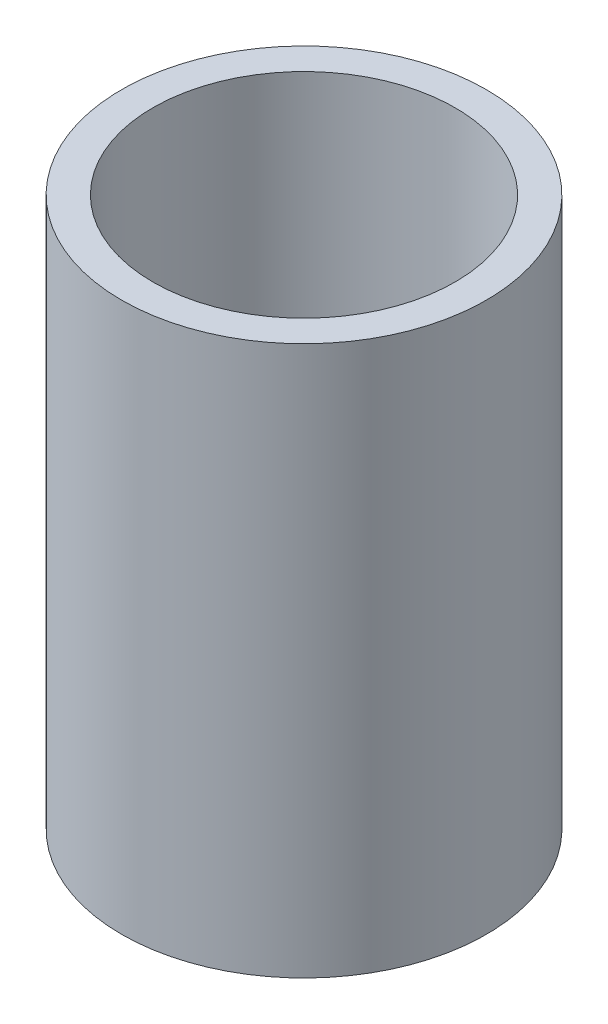
ISO-10303-21;
HEADER;
FILE_DESCRIPTION(('STEP AP214'),'2;1');
FILE_NAME('part.step','',(''),(''),'','','');
FILE_SCHEMA(('AUTOMOTIVE_DESIGN { 1 0 10303 214 1 1 1 1 }'));
ENDSEC;
DATA;
#1=APPLICATION_CONTEXT('core data for automotive mechanical design processes');
#2=APPLICATION_PROTOCOL_DEFINITION('international standard','automotive_design',2000,#1);
#3=PRODUCT_CONTEXT('',#1,'mechanical');
#4=PRODUCT('Part','Part','',(#3));
#5=PRODUCT_RELATED_PRODUCT_CATEGORY('part','',(#4));
#6=PRODUCT_DEFINITION_FORMATION('','',#4);
#7=PRODUCT_DEFINITION_CONTEXT('part definition',#1,'design');
#8=PRODUCT_DEFINITION('design','',#6,#7);
#9=PRODUCT_DEFINITION_SHAPE('','',#8);
#10=(LENGTH_UNIT() NAMED_UNIT(*) SI_UNIT(.MILLI.,.METRE.));
#11=(NAMED_UNIT(*) PLANE_ANGLE_UNIT() SI_UNIT($,.RADIAN.));
#12=(NAMED_UNIT(*) SI_UNIT($,.STERADIAN.) SOLID_ANGLE_UNIT());
#13=UNCERTAINTY_MEASURE_WITH_UNIT(LENGTH_MEASURE(1.E-05),#10,'distance_accuracy_value','');
#14=(GEOMETRIC_REPRESENTATION_CONTEXT(3) GLOBAL_UNCERTAINTY_ASSIGNED_CONTEXT((#13)) GLOBAL_UNIT_ASSIGNED_CONTEXT((#10,
#11,#12)) REPRESENTATION_CONTEXT('',''));
#15=CARTESIAN_POINT('',(0.,0.,0.));
#16=DIRECTION('',(0.,0.,1.));
#17=DIRECTION('',(1.,0.,0.));
#18=AXIS2_PLACEMENT_3D('',#15,#16,#17);
#19=CARTESIAN_POINT('',(0.,63.5,0.));
#20=DIRECTION('',(0.,1.,0.));
#21=DIRECTION('',(0.,0.,1.));
#22=AXIS2_PLACEMENT_3D('',#19,#20,#21);
#23=PLANE('',#22);
#24=CARTESIAN_POINT('',(0.,63.5,0.));
#25=DIRECTION('',(0.,1.,0.));
#26=DIRECTION('',(0.,0.,1.));
#27=AXIS2_PLACEMENT_3D('',#24,#25,#26);
#28=CIRCLE('',#27,21.082);
#29=CARTESIAN_POINT('',(0.,63.5,21.082));
#30=VERTEX_POINT('',#29);
#31=EDGE_CURVE('E12',#30,#30,#28,.T.);
#32=ORIENTED_EDGE('',*,*,#31,.T.);
#33=EDGE_LOOP('',(#32));
#34=FACE_BOUND('',#33,.T.);
#35=CARTESIAN_POINT('',(0.,63.5,0.));
#36=DIRECTION('',(0.,1.,0.));
#37=DIRECTION('',(0.,0.,1.));
#38=AXIS2_PLACEMENT_3D('',#35,#36,#37);
#39=CIRCLE('',#38,17.4625);
#40=CARTESIAN_POINT('',(0.,63.5,17.4625));
#41=VERTEX_POINT('',#40);
#42=EDGE_CURVE('E51',#41,#41,#39,.T.);
#43=ORIENTED_EDGE('',*,*,#42,.F.);
#44=EDGE_LOOP('',(#43));
#45=FACE_BOUND('',#44,.T.);
#46=ADVANCED_FACE('F40',(#34,#45),#23,.T.);
#47=CARTESIAN_POINT('',(0.,0.,0.));
#48=DIRECTION('',(0.,1.,0.));
#49=DIRECTION('',(0.,0.,1.));
#50=AXIS2_PLACEMENT_3D('',#47,#48,#49);
#51=PLANE('',#50);
#52=CARTESIAN_POINT('',(0.,0.,0.));
#53=DIRECTION('',(0.,1.,0.));
#54=DIRECTION('',(0.,0.,1.));
#55=AXIS2_PLACEMENT_3D('',#52,#53,#54);
#56=CIRCLE('',#55,21.082);
#57=CARTESIAN_POINT('',(0.,0.,21.082));
#58=VERTEX_POINT('',#57);
#59=EDGE_CURVE('E44',#58,#58,#56,.T.);
#60=ORIENTED_EDGE('',*,*,#59,.F.);
#61=EDGE_LOOP('',(#60));
#62=FACE_BOUND('',#61,.T.);
#63=CARTESIAN_POINT('',(0.,0.,0.));
#64=DIRECTION('',(0.,1.,0.));
#65=DIRECTION('',(0.,0.,1.));
#66=AXIS2_PLACEMENT_3D('',#63,#64,#65);
#67=CIRCLE('',#66,17.4625);
#68=CARTESIAN_POINT('',(0.,0.,17.4625));
#69=VERTEX_POINT('',#68);
#70=EDGE_CURVE('E53',#69,#69,#67,.T.);
#71=ORIENTED_EDGE('',*,*,#70,.T.);
#72=EDGE_LOOP('',(#71));
#73=FACE_BOUND('',#72,.T.);
#74=ADVANCED_FACE('F63',(#62,#73),#51,.F.);
#75=CARTESIAN_POINT('',(0.,63.5,0.));
#76=DIRECTION('',(0.,-1.,0.));
#77=DIRECTION('',(0.,0.,-1.));
#78=AXIS2_PLACEMENT_3D('',#75,#76,#77);
#79=CYLINDRICAL_SURFACE('',#78,21.082);
#80=ORIENTED_EDGE('',*,*,#31,.F.);
#81=EDGE_LOOP('',(#80));
#82=FACE_BOUND('',#81,.T.);
#83=ORIENTED_EDGE('',*,*,#59,.T.);
#84=EDGE_LOOP('',(#83));
#85=FACE_BOUND('',#84,.T.);
#86=ADVANCED_FACE('F42',(#82,#85),#79,.T.);
#87=CARTESIAN_POINT('',(0.,63.5,0.));
#88=DIRECTION('',(0.,-1.,0.));
#89=DIRECTION('',(0.,0.,-1.));
#90=AXIS2_PLACEMENT_3D('',#87,#88,#89);
#91=CYLINDRICAL_SURFACE('',#90,17.4625);
#92=ORIENTED_EDGE('',*,*,#42,.T.);
#93=EDGE_LOOP('',(#92));
#94=FACE_BOUND('',#93,.T.);
#95=ORIENTED_EDGE('',*,*,#70,.F.);
#96=EDGE_LOOP('',(#95));
#97=FACE_BOUND('',#96,.T.);
#98=ADVANCED_FACE('F59',(#94,#97),#91,.F.);
#99=CLOSED_SHELL('',(#46,#74,#86,#98));
#100=MANIFOLD_SOLID_BREP('B2',#99);
#101=ADVANCED_BREP_SHAPE_REPRESENTATION('',(#18,#100),#14);
#102=SHAPE_DEFINITION_REPRESENTATION(#9,#101);
ENDSEC;
END-ISO-10303-21;
